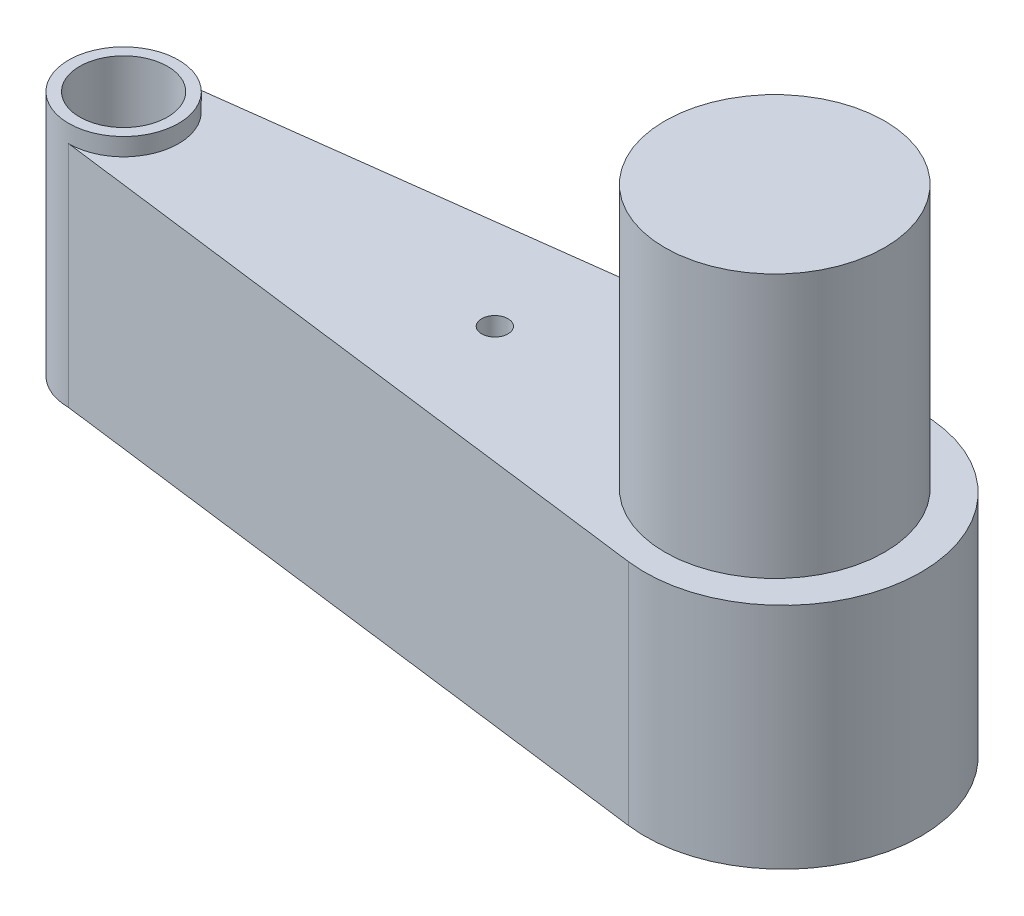
ISO-10303-21;
HEADER;
FILE_DESCRIPTION(('STEP AP214'),'2;1');
FILE_NAME('part.step','',(''),(''),'','','');
FILE_SCHEMA(('AUTOMOTIVE_DESIGN { 1 0 10303 214 1 1 1 1 }'));
ENDSEC;
DATA;
#1=APPLICATION_CONTEXT('core data for automotive mechanical design processes');
#2=APPLICATION_PROTOCOL_DEFINITION('international standard','automotive_design',2000,#1);
#3=PRODUCT_CONTEXT('',#1,'mechanical');
#4=PRODUCT('Part','Part','',(#3));
#5=PRODUCT_RELATED_PRODUCT_CATEGORY('part','',(#4));
#6=PRODUCT_DEFINITION_FORMATION('','',#4);
#7=PRODUCT_DEFINITION_CONTEXT('part definition',#1,'design');
#8=PRODUCT_DEFINITION('design','',#6,#7);
#9=PRODUCT_DEFINITION_SHAPE('','',#8);
#10=(LENGTH_UNIT() NAMED_UNIT(*) SI_UNIT(.MILLI.,.METRE.));
#11=(NAMED_UNIT(*) PLANE_ANGLE_UNIT() SI_UNIT($,.RADIAN.));
#12=(NAMED_UNIT(*) SI_UNIT($,.STERADIAN.) SOLID_ANGLE_UNIT());
#13=UNCERTAINTY_MEASURE_WITH_UNIT(LENGTH_MEASURE(1.E-05),#10,'distance_accuracy_value','');
#14=(GEOMETRIC_REPRESENTATION_CONTEXT(3) GLOBAL_UNCERTAINTY_ASSIGNED_CONTEXT((#13)) GLOBAL_UNIT_ASSIGNED_CONTEXT((#10,
#11,#12)) REPRESENTATION_CONTEXT('',''));
#15=CARTESIAN_POINT('',(0.,0.,0.));
#16=DIRECTION('',(0.,0.,1.));
#17=DIRECTION('',(1.,0.,0.));
#18=AXIS2_PLACEMENT_3D('',#15,#16,#17);
#19=CARTESIAN_POINT('',(55.4310193809195,26.,6.25));
#20=DIRECTION('',(0.,-1.,0.));
#21=DIRECTION('',(0.,0.,-1.));
#22=AXIS2_PLACEMENT_3D('',#19,#20,#21);
#23=PLANE('',#22);
#24=CARTESIAN_POINT('',(54.5916756493341,26.,6.33734470662262));
#25=DIRECTION('',(0.,-1.,0.));
#26=DIRECTION('',(0.,0.,-1.));
#27=AXIS2_PLACEMENT_3D('',#24,#25,#26);
#28=CIRCLE('',#27,12.5);
#29=CARTESIAN_POINT('',(54.5916756493341,26.,-6.16265529337739));
#30=VERTEX_POINT('',#29);
#31=EDGE_CURVE('E11',#30,#30,#28,.F.);
#32=ORIENTED_EDGE('',*,*,#31,.F.);
#33=EDGE_LOOP('',(#32));
#34=FACE_BOUND('',#33,.T.);
#35=CARTESIAN_POINT('',(22.6607100556521,26.,6.25000000000001));
#36=DIRECTION('',(0.,1.,0.));
#37=DIRECTION('',(0.,0.,1.));
#38=AXIS2_PLACEMENT_3D('',#35,#36,#37);
#39=CIRCLE('',#38,1.5);
#40=CARTESIAN_POINT('',(22.6607100556521,26.,4.75000000000001));
#41=VERTEX_POINT('',#40);
#42=EDGE_CURVE('E103',#41,#41,#39,.T.);
#43=ORIENTED_EDGE('',*,*,#42,.F.);
#44=EDGE_LOOP('',(#43));
#45=FACE_BOUND('',#44,.T.);
#46=CARTESIAN_POINT('',(-19.5689806190805,26.,6.25));
#47=DIRECTION('',(0.,1.,0.));
#48=DIRECTION('',(0.,0.,1.));
#49=AXIS2_PLACEMENT_3D('',#46,#47,#48);
#50=CIRCLE('',#49,6.25);
#51=CARTESIAN_POINT('',(-19.5689806190805,26.,12.5));
#52=VERTEX_POINT('',#51);
#53=CARTESIAN_POINT('',(-19.5689806190805,26.,0.));
#54=VERTEX_POINT('',#53);
#55=EDGE_CURVE('E90',#52,#54,#50,.T.);
#56=ORIENTED_EDGE('',*,*,#55,.F.);
#57=DIRECTION('',(0.991928597676918,0.,0.126797701519795));
#58=VECTOR('',#57,1.);
#59=CARTESIAN_POINT('',(-19.5689806190805,26.,12.5));
#60=LINE('',#59,#58);
#61=CARTESIAN_POINT('',(53.4391059335093,26.,21.8325846123471));
#62=VERTEX_POINT('',#61);
#63=EDGE_CURVE('E50',#52,#62,#60,.T.);
#64=ORIENTED_EDGE('',*,*,#63,.T.);
#65=CARTESIAN_POINT('',(55.4310193809195,26.,6.25));
#66=DIRECTION('',(0.,1.,0.));
#67=DIRECTION('',(0.,0.,-1.));
#68=AXIS2_PLACEMENT_3D('',#65,#66,#67);
#69=CIRCLE('',#68,15.7093813494654);
#70=CARTESIAN_POINT('',(53.4391059335093,26.,-9.33258461234709));
#71=VERTEX_POINT('',#70);
#72=EDGE_CURVE('E112',#62,#71,#69,.T.);
#73=ORIENTED_EDGE('',*,*,#72,.T.);
#74=DIRECTION('',(-0.991928597676918,0.,0.126797701519795));
#75=VECTOR('',#74,1.);
#76=CARTESIAN_POINT('',(-19.5689806190805,26.,0.));
#77=LINE('',#76,#75);
#78=EDGE_CURVE('E80',#71,#54,#77,.T.);
#79=ORIENTED_EDGE('',*,*,#78,.T.);
#80=EDGE_LOOP('',(#56,#64,#73,#79));
#81=FACE_BOUND('',#80,.T.);
#82=ADVANCED_FACE('F33',(#34,#45,#81),#23,.F.);
#83=CARTESIAN_POINT('',(55.4310193809195,0.,6.25));
#84=DIRECTION('',(0.,-1.,0.));
#85=DIRECTION('',(0.,0.,-1.));
#86=AXIS2_PLACEMENT_3D('',#83,#84,#85);
#87=PLANE('',#86);
#88=CARTESIAN_POINT('',(-19.5689806190805,0.,6.25));
#89=DIRECTION('',(0.,1.,0.));
#90=DIRECTION('',(0.,0.,1.));
#91=AXIS2_PLACEMENT_3D('',#88,#89,#90);
#92=CIRCLE('',#91,5.);
#93=CARTESIAN_POINT('',(-19.5689806190805,0.,1.25));
#94=VERTEX_POINT('',#93);
#95=EDGE_CURVE('E106',#94,#94,#92,.T.);
#96=ORIENTED_EDGE('',*,*,#95,.T.);
#97=EDGE_LOOP('',(#96));
#98=FACE_BOUND('',#97,.T.);
#99=CARTESIAN_POINT('',(55.4310193809195,0.,6.25));
#100=DIRECTION('',(0.,1.,0.));
#101=DIRECTION('',(0.,0.,-1.));
#102=AXIS2_PLACEMENT_3D('',#99,#100,#101);
#103=CIRCLE('',#102,15.7093813494654);
#104=CARTESIAN_POINT('',(53.4391059335093,0.,21.8325846123471));
#105=VERTEX_POINT('',#104);
#106=CARTESIAN_POINT('',(53.4391059335093,0.,-9.33258461234709));
#107=VERTEX_POINT('',#106);
#108=EDGE_CURVE('E111',#105,#107,#103,.T.);
#109=ORIENTED_EDGE('',*,*,#108,.F.);
#110=DIRECTION('',(0.991928597676918,0.,0.126797701519795));
#111=VECTOR('',#110,1.);
#112=CARTESIAN_POINT('',(-19.5689806190805,0.,12.5));
#113=LINE('',#112,#111);
#114=CARTESIAN_POINT('',(-19.5689806190805,0.,12.5));
#115=VERTEX_POINT('',#114);
#116=EDGE_CURVE('E74',#115,#105,#113,.T.);
#117=ORIENTED_EDGE('',*,*,#116,.F.);
#118=CARTESIAN_POINT('',(-19.5689806190805,0.,6.25));
#119=DIRECTION('',(0.,1.,0.));
#120=DIRECTION('',(0.,0.,1.));
#121=AXIS2_PLACEMENT_3D('',#118,#119,#120);
#122=CIRCLE('',#121,6.25);
#123=CARTESIAN_POINT('',(-19.5689806190805,0.,0.));
#124=VERTEX_POINT('',#123);
#125=EDGE_CURVE('E69',#124,#115,#122,.T.);
#126=ORIENTED_EDGE('',*,*,#125,.F.);
#127=DIRECTION('',(-0.991928597676918,0.,0.126797701519795));
#128=VECTOR('',#127,1.);
#129=CARTESIAN_POINT('',(-19.5689806190805,0.,0.));
#130=LINE('',#129,#128);
#131=EDGE_CURVE('E117',#107,#124,#130,.T.);
#132=ORIENTED_EDGE('',*,*,#131,.F.);
#133=EDGE_LOOP('',(#109,#117,#126,#132));
#134=FACE_BOUND('',#133,.T.);
#135=CARTESIAN_POINT('',(22.6607100556521,0.,6.25000000000001));
#136=DIRECTION('',(0.,1.,0.));
#137=DIRECTION('',(0.,0.,1.));
#138=AXIS2_PLACEMENT_3D('',#135,#136,#137);
#139=CIRCLE('',#138,1.5);
#140=CARTESIAN_POINT('',(22.6607100556521,0.,4.75000000000001));
#141=VERTEX_POINT('',#140);
#142=EDGE_CURVE('E97',#141,#141,#139,.T.);
#143=ORIENTED_EDGE('',*,*,#142,.T.);
#144=EDGE_LOOP('',(#143));
#145=FACE_BOUND('',#144,.T.);
#146=ADVANCED_FACE('F127',(#98,#134,#145),#87,.T.);
#147=CARTESIAN_POINT('',(55.4310193809195,26.,6.25));
#148=DIRECTION('',(0.,-1.,0.));
#149=DIRECTION('',(0.,0.,-1.));
#150=AXIS2_PLACEMENT_3D('',#147,#148,#149);
#151=CYLINDRICAL_SURFACE('',#150,15.7093813494654);
#152=ORIENTED_EDGE('',*,*,#108,.T.);
#153=DIRECTION('',(0.,-1.,0.));
#154=VECTOR('',#153,1.);
#155=CARTESIAN_POINT('',(53.4391059335093,26.,-9.33258461234709));
#156=LINE('',#155,#154);
#157=EDGE_CURVE('E42',#71,#107,#156,.T.);
#158=ORIENTED_EDGE('',*,*,#157,.F.);
#159=ORIENTED_EDGE('',*,*,#72,.F.);
#160=DIRECTION('',(0.,-1.,0.));
#161=VECTOR('',#160,1.);
#162=CARTESIAN_POINT('',(53.4391059335093,26.,21.8325846123471));
#163=LINE('',#162,#161);
#164=EDGE_CURVE('E84',#62,#105,#163,.T.);
#165=ORIENTED_EDGE('',*,*,#164,.T.);
#166=EDGE_LOOP('',(#152,#158,#159,#165));
#167=FACE_BOUND('',#166,.T.);
#168=ADVANCED_FACE('F35',(#167),#151,.T.);
#169=CARTESIAN_POINT('',(-19.5689806190805,26.,0.));
#170=DIRECTION('',(0.126797701519795,0.,0.991928597676918));
#171=DIRECTION('',(0.991928597676918,0.,-0.126797701519795));
#172=AXIS2_PLACEMENT_3D('',#169,#170,#171);
#173=PLANE('',#172);
#174=ORIENTED_EDGE('',*,*,#131,.T.);
#175=DIRECTION('',(0.,-1.,0.));
#176=VECTOR('',#175,1.);
#177=CARTESIAN_POINT('',(-19.5689806190805,26.,0.));
#178=LINE('',#177,#176);
#179=EDGE_CURVE('E91',#54,#124,#178,.T.);
#180=ORIENTED_EDGE('',*,*,#179,.F.);
#181=ORIENTED_EDGE('',*,*,#78,.F.);
#182=ORIENTED_EDGE('',*,*,#157,.T.);
#183=EDGE_LOOP('',(#174,#180,#181,#182));
#184=FACE_BOUND('',#183,.T.);
#185=ADVANCED_FACE('F123',(#184),#173,.F.);
#186=CARTESIAN_POINT('',(-19.5689806190805,26.,6.25));
#187=DIRECTION('',(0.,-1.,0.));
#188=DIRECTION('',(0.,0.,-1.));
#189=AXIS2_PLACEMENT_3D('',#186,#187,#188);
#190=CYLINDRICAL_SURFACE('',#189,6.25);
#191=ORIENTED_EDGE('',*,*,#125,.T.);
#192=DIRECTION('',(0.,-1.,0.));
#193=VECTOR('',#192,1.);
#194=CARTESIAN_POINT('',(-19.5689806190805,26.,12.5));
#195=LINE('',#194,#193);
#196=EDGE_CURVE('E83',#52,#115,#195,.T.);
#197=ORIENTED_EDGE('',*,*,#196,.F.);
#198=ORIENTED_EDGE('',*,*,#55,.T.);
#199=ORIENTED_EDGE('',*,*,#179,.T.);
#200=EDGE_LOOP('',(#191,#197,#198,#199));
#201=FACE_BOUND('',#200,.T.);
#202=CARTESIAN_POINT('',(-19.5689806190805,28.,6.25));
#203=DIRECTION('',(0.,1.,0.));
#204=DIRECTION('',(0.,0.,1.));
#205=AXIS2_PLACEMENT_3D('',#202,#203,#204);
#206=CIRCLE('',#205,6.25);
#207=CARTESIAN_POINT('',(-19.5689806190805,28.,12.5));
#208=VERTEX_POINT('',#207);
#209=EDGE_CURVE('E93',#208,#208,#206,.T.);
#210=ORIENTED_EDGE('',*,*,#209,.F.);
#211=EDGE_LOOP('',(#210));
#212=FACE_BOUND('',#211,.T.);
#213=ADVANCED_FACE('F88',(#201,#212),#190,.T.);
#214=CARTESIAN_POINT('',(-19.5689806190805,26.,12.5));
#215=DIRECTION('',(0.126797701519795,0.,-0.991928597676918));
#216=DIRECTION('',(-0.991928597676918,0.,-0.126797701519795));
#217=AXIS2_PLACEMENT_3D('',#214,#215,#216);
#218=PLANE('',#217);
#219=ORIENTED_EDGE('',*,*,#116,.T.);
#220=ORIENTED_EDGE('',*,*,#164,.F.);
#221=ORIENTED_EDGE('',*,*,#63,.F.);
#222=ORIENTED_EDGE('',*,*,#196,.T.);
#223=EDGE_LOOP('',(#219,#220,#221,#222));
#224=FACE_BOUND('',#223,.T.);
#225=ADVANCED_FACE('F82',(#224),#218,.F.);
#226=CARTESIAN_POINT('',(-19.5689806190805,26.,6.25));
#227=DIRECTION('',(0.,-1.,0.));
#228=DIRECTION('',(0.,0.,-1.));
#229=AXIS2_PLACEMENT_3D('',#226,#227,#228);
#230=CYLINDRICAL_SURFACE('',#229,5.);
#231=CARTESIAN_POINT('',(-19.5689806190805,28.,6.25));
#232=DIRECTION('',(0.,1.,0.));
#233=DIRECTION('',(0.,0.,1.));
#234=AXIS2_PLACEMENT_3D('',#231,#232,#233);
#235=CIRCLE('',#234,5.);
#236=CARTESIAN_POINT('',(-19.5689806190805,28.,1.25));
#237=VERTEX_POINT('',#236);
#238=EDGE_CURVE('E94',#237,#237,#235,.T.);
#239=CARTESIAN_POINT('',(-19.5689806190805,0.,1.25));
#240=CARTESIAN_POINT('',(-19.5689806190805,0.291666666666666,1.25));
#241=CARTESIAN_POINT('',(-19.5689806190805,0.583333333333334,1.25));
#242=CARTESIAN_POINT('',(-19.5689806190805,1.16666666666667,1.25));
#243=CARTESIAN_POINT('',(-19.5689806190805,1.45833333333333,1.25));
#244=CARTESIAN_POINT('',(-19.5689806190805,2.04166666666667,1.25));
#245=CARTESIAN_POINT('',(-19.5689806190805,2.33333333333333,1.25));
#246=CARTESIAN_POINT('',(-19.5689806190805,2.91666666666667,1.25));
#247=CARTESIAN_POINT('',(-19.5689806190805,3.20833333333333,1.25));
#248=CARTESIAN_POINT('',(-19.5689806190805,3.79166666666667,1.25));
#249=CARTESIAN_POINT('',(-19.5689806190805,4.08333333333333,1.25));
#250=CARTESIAN_POINT('',(-19.5689806190805,4.66666666666667,1.25));
#251=CARTESIAN_POINT('',(-19.5689806190805,4.95833333333333,1.25));
#252=CARTESIAN_POINT('',(-19.5689806190805,5.54166666666666,1.25));
#253=CARTESIAN_POINT('',(-19.5689806190805,5.83333333333333,1.25));
#254=CARTESIAN_POINT('',(-19.5689806190805,6.41666666666667,1.25));
#255=CARTESIAN_POINT('',(-19.5689806190805,6.70833333333333,1.25));
#256=CARTESIAN_POINT('',(-19.5689806190805,7.29166666666667,1.25));
#257=CARTESIAN_POINT('',(-19.5689806190805,7.58333333333333,1.25));
#258=CARTESIAN_POINT('',(-19.5689806190805,8.16666666666667,1.25));
#259=CARTESIAN_POINT('',(-19.5689806190805,8.45833333333333,1.25));
#260=CARTESIAN_POINT('',(-19.5689806190805,9.04166666666667,1.25));
#261=CARTESIAN_POINT('',(-19.5689806190805,9.33333333333333,1.25));
#262=CARTESIAN_POINT('',(-19.5689806190805,9.91666666666666,1.25));
#263=CARTESIAN_POINT('',(-19.5689806190805,10.2083333333333,1.25));
#264=CARTESIAN_POINT('',(-19.5689806190805,10.7916666666667,1.25));
#265=CARTESIAN_POINT('',(-19.5689806190805,11.0833333333333,1.25));
#266=CARTESIAN_POINT('',(-19.5689806190805,11.6666666666667,1.25));
#267=CARTESIAN_POINT('',(-19.5689806190805,11.9583333333333,1.25));
#268=CARTESIAN_POINT('',(-19.5689806190805,12.5416666666667,1.25));
#269=CARTESIAN_POINT('',(-19.5689806190805,12.8333333333333,1.25));
#270=CARTESIAN_POINT('',(-19.5689806190805,13.4166666666667,1.25));
#271=CARTESIAN_POINT('',(-19.5689806190805,13.7083333333333,1.25));
#272=CARTESIAN_POINT('',(-19.5689806190805,14.2916666666667,1.25));
#273=CARTESIAN_POINT('',(-19.5689806190805,14.5833333333333,1.25));
#274=CARTESIAN_POINT('',(-19.5689806190805,15.1666666666667,1.25));
#275=CARTESIAN_POINT('',(-19.5689806190805,15.4583333333333,1.25));
#276=CARTESIAN_POINT('',(-19.5689806190805,16.0416666666667,1.25));
#277=CARTESIAN_POINT('',(-19.5689806190805,16.3333333333333,1.25));
#278=CARTESIAN_POINT('',(-19.5689806190805,16.9166666666667,1.25));
#279=CARTESIAN_POINT('',(-19.5689806190805,17.2083333333333,1.25));
#280=CARTESIAN_POINT('',(-19.5689806190805,17.7916666666667,1.25));
#281=CARTESIAN_POINT('',(-19.5689806190805,18.0833333333333,1.25));
#282=CARTESIAN_POINT('',(-19.5689806190805,18.6666666666667,1.25));
#283=CARTESIAN_POINT('',(-19.5689806190805,18.9583333333333,1.25));
#284=CARTESIAN_POINT('',(-19.5689806190805,19.5416666666667,1.25));
#285=CARTESIAN_POINT('',(-19.5689806190805,19.8333333333333,1.25));
#286=CARTESIAN_POINT('',(-19.5689806190805,20.4166666666667,1.25));
#287=CARTESIAN_POINT('',(-19.5689806190805,20.7083333333333,1.25));
#288=CARTESIAN_POINT('',(-19.5689806190805,21.2916666666667,1.25));
#289=CARTESIAN_POINT('',(-19.5689806190805,21.5833333333333,1.25));
#290=CARTESIAN_POINT('',(-19.5689806190805,22.1666666666667,1.25));
#291=CARTESIAN_POINT('',(-19.5689806190805,22.4583333333333,1.25));
#292=CARTESIAN_POINT('',(-19.5689806190805,23.0416666666667,1.25));
#293=CARTESIAN_POINT('',(-19.5689806190805,23.3333333333333,1.25));
#294=CARTESIAN_POINT('',(-19.5689806190805,23.9166666666667,1.25));
#295=CARTESIAN_POINT('',(-19.5689806190805,24.2083333333333,1.25));
#296=CARTESIAN_POINT('',(-19.5689806190805,24.7916666666667,1.25));
#297=CARTESIAN_POINT('',(-19.5689806190805,25.0833333333333,1.25));
#298=CARTESIAN_POINT('',(-19.5689806190805,25.6666666666667,1.25));
#299=CARTESIAN_POINT('',(-19.5689806190805,25.9583333333333,1.25));
#300=CARTESIAN_POINT('',(-19.5689806190805,26.5416666666667,1.25));
#301=CARTESIAN_POINT('',(-19.5689806190805,26.8333333333333,1.25));
#302=CARTESIAN_POINT('',(-19.5689806190805,27.4166666666667,1.25));
#303=CARTESIAN_POINT('',(-19.5689806190805,27.7083333333333,1.25));
#304=CARTESIAN_POINT('',(-19.5689806190805,28.,1.25));
#305=B_SPLINE_CURVE_WITH_KNOTS('',3,(#239,#240,#241,#242,#243,#244,#245,#246,#247,#248,#249,
#250,#251,#252,#253,#254,#255,#256,#257,#258,#259,#260,#261,#262,#263,#264,#265,#266,#267,#268,
#269,#270,#271,#272,#273,#274,#275,#276,#277,#278,#279,#280,#281,#282,#283,#284,#285,#286,#287,
#288,#289,#290,#291,#292,#293,#294,#295,#296,#297,#298,#299,#300,#301,#302,#303,#304),
.UNSPECIFIED.,.F.,.F.,(4,2,2,2,2,2,2,2,2,2,2,2,2,2,2,2,2,2,2,2,2,2,2,2,2,2,2,2,2,2,2,2,4),(0.,
0.875000000000001,1.75,2.625,3.5,4.375,5.25,6.125,7.,7.875,8.75,9.625,10.5,11.375,12.25,13.125,
14.,14.875,15.75,16.625,17.5,18.375,19.25,20.125,21.,21.875,22.75,23.625,24.5,25.375,26.25,
27.125,28.),.UNSPECIFIED.);
#306=EDGE_CURVE('BSEAM137',#94,#237,#305,.T.);
#307=ORIENTED_EDGE('',*,*,#95,.F.);
#308=ORIENTED_EDGE('',*,*,#238,.T.);
#309=ORIENTED_EDGE('',*,*,#306,.T.);
#310=ORIENTED_EDGE('',*,*,#306,.F.);
#311=EDGE_LOOP('',(#307,#309,#308,#310));
#312=FACE_BOUND('',#311,.T.);
#313=ADVANCED_FACE('F137',(#312),#230,.F.);
#314=CARTESIAN_POINT('',(22.6607100556521,26.,6.25000000000001));
#315=DIRECTION('',(0.,-1.,0.));
#316=DIRECTION('',(0.,0.,-1.));
#317=AXIS2_PLACEMENT_3D('',#314,#315,#316);
#318=CYLINDRICAL_SURFACE('',#317,1.5);
#319=CARTESIAN_POINT('',(22.6607100556521,26.,4.75000000000001));
#320=CARTESIAN_POINT('',(22.6607100556521,25.7291666666667,4.75000000000001));
#321=CARTESIAN_POINT('',(22.6607100556521,25.4583333333333,4.75000000000001));
#322=CARTESIAN_POINT('',(22.6607100556521,24.9166666666667,4.75000000000001));
#323=CARTESIAN_POINT('',(22.6607100556521,24.6458333333333,4.75000000000001));
#324=CARTESIAN_POINT('',(22.6607100556521,24.1041666666667,4.75000000000001));
#325=CARTESIAN_POINT('',(22.6607100556521,23.8333333333333,4.75000000000001));
#326=CARTESIAN_POINT('',(22.6607100556521,23.2916666666667,4.75000000000001));
#327=CARTESIAN_POINT('',(22.6607100556521,23.0208333333333,4.75000000000001));
#328=CARTESIAN_POINT('',(22.6607100556521,22.4791666666667,4.75000000000001));
#329=CARTESIAN_POINT('',(22.6607100556521,22.2083333333333,4.75000000000001));
#330=CARTESIAN_POINT('',(22.6607100556521,21.6666666666667,4.75000000000001));
#331=CARTESIAN_POINT('',(22.6607100556521,21.3958333333333,4.75000000000001));
#332=CARTESIAN_POINT('',(22.6607100556521,20.8541666666667,4.75000000000001));
#333=CARTESIAN_POINT('',(22.6607100556521,20.5833333333333,4.75000000000001));
#334=CARTESIAN_POINT('',(22.6607100556521,20.0416666666667,4.75000000000001));
#335=CARTESIAN_POINT('',(22.6607100556521,19.7708333333333,4.75000000000001));
#336=CARTESIAN_POINT('',(22.6607100556521,19.2291666666667,4.75000000000001));
#337=CARTESIAN_POINT('',(22.6607100556521,18.9583333333333,4.75000000000001));
#338=CARTESIAN_POINT('',(22.6607100556521,18.4166666666667,4.75000000000001));
#339=CARTESIAN_POINT('',(22.6607100556521,18.1458333333333,4.75000000000001));
#340=CARTESIAN_POINT('',(22.6607100556521,17.6041666666667,4.75000000000001));
#341=CARTESIAN_POINT('',(22.6607100556521,17.3333333333333,4.75000000000001));
#342=CARTESIAN_POINT('',(22.6607100556521,16.7916666666667,4.75000000000001));
#343=CARTESIAN_POINT('',(22.6607100556521,16.5208333333333,4.75000000000001));
#344=CARTESIAN_POINT('',(22.6607100556521,15.9791666666667,4.75000000000001));
#345=CARTESIAN_POINT('',(22.6607100556521,15.7083333333333,4.75000000000001));
#346=CARTESIAN_POINT('',(22.6607100556521,15.1666666666667,4.75000000000001));
#347=CARTESIAN_POINT('',(22.6607100556521,14.8958333333333,4.75000000000001));
#348=CARTESIAN_POINT('',(22.6607100556521,14.3541666666667,4.75000000000001));
#349=CARTESIAN_POINT('',(22.6607100556521,14.0833333333333,4.75000000000001));
#350=CARTESIAN_POINT('',(22.6607100556521,13.5416666666667,4.75000000000001));
#351=CARTESIAN_POINT('',(22.6607100556521,13.2708333333333,4.75000000000001));
#352=CARTESIAN_POINT('',(22.6607100556521,12.7291666666667,4.75000000000001));
#353=CARTESIAN_POINT('',(22.6607100556521,12.4583333333333,4.75000000000001));
#354=CARTESIAN_POINT('',(22.6607100556521,11.9166666666667,4.75000000000001));
#355=CARTESIAN_POINT('',(22.6607100556521,11.6458333333333,4.75000000000001));
#356=CARTESIAN_POINT('',(22.6607100556521,11.1041666666667,4.75000000000001));
#357=CARTESIAN_POINT('',(22.6607100556521,10.8333333333333,4.75000000000001));
#358=CARTESIAN_POINT('',(22.6607100556521,10.2916666666667,4.75000000000001));
#359=CARTESIAN_POINT('',(22.6607100556521,10.0208333333333,4.75000000000001));
#360=CARTESIAN_POINT('',(22.6607100556521,9.47916666666667,4.75000000000001));
#361=CARTESIAN_POINT('',(22.6607100556521,9.20833333333333,4.75000000000001));
#362=CARTESIAN_POINT('',(22.6607100556521,8.66666666666667,4.75000000000001));
#363=CARTESIAN_POINT('',(22.6607100556521,8.39583333333333,4.75000000000001));
#364=CARTESIAN_POINT('',(22.6607100556521,7.85416666666667,4.75000000000001));
#365=CARTESIAN_POINT('',(22.6607100556521,7.58333333333333,4.75000000000001));
#366=CARTESIAN_POINT('',(22.6607100556521,7.04166666666667,4.75000000000001));
#367=CARTESIAN_POINT('',(22.6607100556521,6.77083333333333,4.75000000000001));
#368=CARTESIAN_POINT('',(22.6607100556521,6.22916666666667,4.75000000000001));
#369=CARTESIAN_POINT('',(22.6607100556521,5.95833333333333,4.75000000000001));
#370=CARTESIAN_POINT('',(22.6607100556521,5.41666666666667,4.75000000000001));
#371=CARTESIAN_POINT('',(22.6607100556521,5.14583333333333,4.75000000000001));
#372=CARTESIAN_POINT('',(22.6607100556521,4.60416666666667,4.75000000000001));
#373=CARTESIAN_POINT('',(22.6607100556521,4.33333333333333,4.75000000000001));
#374=CARTESIAN_POINT('',(22.6607100556521,3.79166666666667,4.75000000000001));
#375=CARTESIAN_POINT('',(22.6607100556521,3.52083333333333,4.75000000000001));
#376=CARTESIAN_POINT('',(22.6607100556521,2.97916666666667,4.75000000000001));
#377=CARTESIAN_POINT('',(22.6607100556521,2.70833333333333,4.75000000000001));
#378=CARTESIAN_POINT('',(22.6607100556521,2.16666666666667,4.75000000000001));
#379=CARTESIAN_POINT('',(22.6607100556521,1.89583333333333,4.75000000000001));
#380=CARTESIAN_POINT('',(22.6607100556521,1.35416666666667,4.75000000000001));
#381=CARTESIAN_POINT('',(22.6607100556521,1.08333333333333,4.75000000000001));
#382=CARTESIAN_POINT('',(22.6607100556521,0.541666666666667,4.75000000000001));
#383=CARTESIAN_POINT('',(22.6607100556521,0.270833333333334,4.75000000000001));
#384=CARTESIAN_POINT('',(22.6607100556521,0.,4.75000000000001));
#385=B_SPLINE_CURVE_WITH_KNOTS('',3,(#319,#320,#321,#322,#323,#324,#325,#326,#327,#328,#329,
#330,#331,#332,#333,#334,#335,#336,#337,#338,#339,#340,#341,#342,#343,#344,#345,#346,#347,#348,
#349,#350,#351,#352,#353,#354,#355,#356,#357,#358,#359,#360,#361,#362,#363,#364,#365,#366,#367,
#368,#369,#370,#371,#372,#373,#374,#375,#376,#377,#378,#379,#380,#381,#382,#383,#384),
.UNSPECIFIED.,.F.,.F.,(4,2,2,2,2,2,2,2,2,2,2,2,2,2,2,2,2,2,2,2,2,2,2,2,2,2,2,2,2,2,2,2,4),(0.,
0.812500000000001,1.625,2.4375,3.25,4.0625,4.875,5.6875,6.5,7.3125,8.125,8.9375,9.75,10.5625,
11.375,12.1875,13.,13.8125,14.625,15.4375,16.25,17.0625,17.875,18.6875,19.5,20.3125,21.125,
21.9375,22.75,23.5625,24.375,25.1875,26.),.UNSPECIFIED.);
#386=EDGE_CURVE('BSEAM134',#41,#141,#385,.T.);
#387=ORIENTED_EDGE('',*,*,#42,.T.);
#388=ORIENTED_EDGE('',*,*,#142,.F.);
#389=ORIENTED_EDGE('',*,*,#386,.T.);
#390=ORIENTED_EDGE('',*,*,#386,.F.);
#391=EDGE_LOOP('',(#387,#389,#388,#390));
#392=FACE_BOUND('',#391,.T.);
#393=ADVANCED_FACE('F134',(#392),#318,.F.);
#394=CARTESIAN_POINT('',(-19.5689806190805,28.,6.25));
#395=DIRECTION('',(0.,1.,0.));
#396=DIRECTION('',(0.,0.,1.));
#397=AXIS2_PLACEMENT_3D('',#394,#395,#396);
#398=PLANE('',#397);
#399=ORIENTED_EDGE('',*,*,#238,.F.);
#400=EDGE_LOOP('',(#399));
#401=FACE_BOUND('',#400,.T.);
#402=ORIENTED_EDGE('',*,*,#209,.T.);
#403=EDGE_LOOP('',(#402));
#404=FACE_BOUND('',#403,.T.);
#405=ADVANCED_FACE('F136',(#401,#404),#398,.T.);
#406=CARTESIAN_POINT('',(54.5916756493341,56.,6.33734470662262));
#407=DIRECTION('',(0.,-1.,0.));
#408=DIRECTION('',(0.,0.,-1.));
#409=AXIS2_PLACEMENT_3D('',#406,#407,#408);
#410=CYLINDRICAL_SURFACE('',#409,12.5);
#411=CARTESIAN_POINT('',(54.5916756493341,56.,6.33734470662262));
#412=DIRECTION('',(0.,1.,0.));
#413=DIRECTION('',(0.,0.,1.));
#414=AXIS2_PLACEMENT_3D('',#411,#412,#413);
#415=CIRCLE('',#414,12.5);
#416=CARTESIAN_POINT('',(54.5916756493341,56.,18.8373447066226));
#417=VERTEX_POINT('',#416);
#418=EDGE_CURVE('E100',#417,#417,#415,.T.);
#419=ORIENTED_EDGE('',*,*,#418,.F.);
#420=EDGE_LOOP('',(#419));
#421=FACE_BOUND('',#420,.T.);
#422=ORIENTED_EDGE('',*,*,#31,.T.);
#423=EDGE_LOOP('',(#422));
#424=FACE_BOUND('',#423,.T.);
#425=ADVANCED_FACE('F144',(#421,#424),#410,.T.);
#426=CARTESIAN_POINT('',(54.5916756493341,56.,6.33734470662262));
#427=DIRECTION('',(0.,1.,0.));
#428=DIRECTION('',(0.,0.,1.));
#429=AXIS2_PLACEMENT_3D('',#426,#427,#428);
#430=PLANE('',#429);
#431=ORIENTED_EDGE('',*,*,#418,.T.);
#432=EDGE_LOOP('',(#431));
#433=FACE_BOUND('',#432,.T.);
#434=ADVANCED_FACE('F215',(#433),#430,.T.);
#435=CLOSED_SHELL('',(#82,#146,#168,#185,#213,#225,#313,#393,#405,#425,#434));
#436=MANIFOLD_SOLID_BREP('B2',#435);
#437=ADVANCED_BREP_SHAPE_REPRESENTATION('',(#18,#436),#14);
#438=SHAPE_DEFINITION_REPRESENTATION(#9,#437);
ENDSEC;
END-ISO-10303-21;
